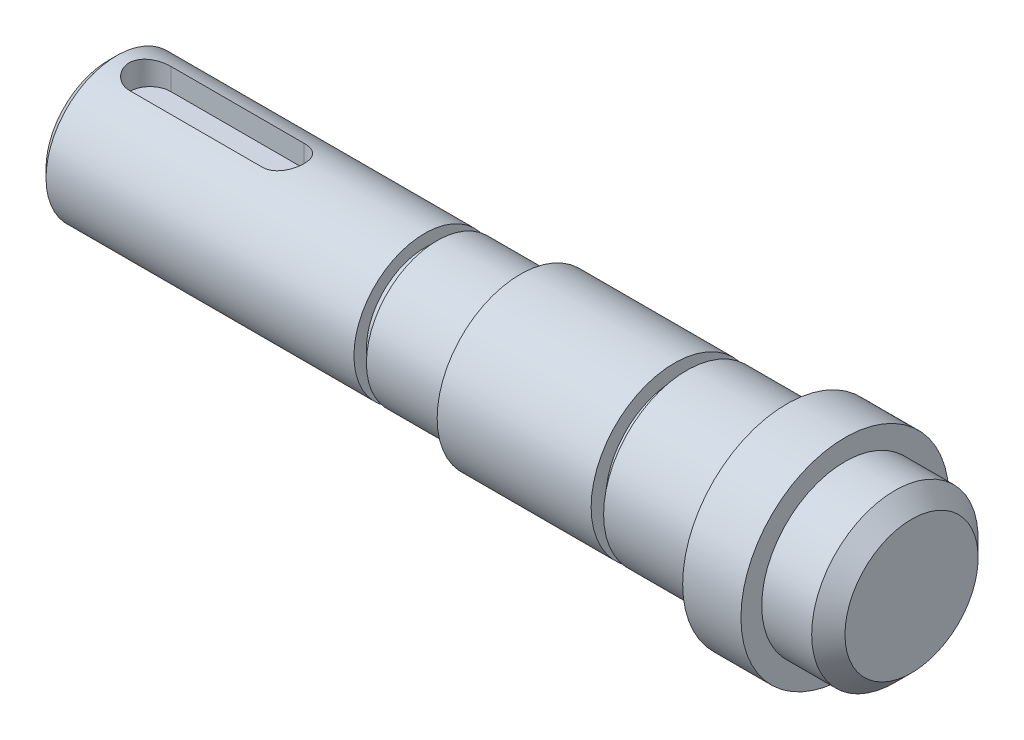
ISO-10303-21;
HEADER;
FILE_DESCRIPTION(('STEP AP214'),'2;1');
FILE_NAME('part.step','',(''),(''),'','','');
FILE_SCHEMA(('AUTOMOTIVE_DESIGN { 1 0 10303 214 1 1 1 1 }'));
ENDSEC;
DATA;
#1=APPLICATION_CONTEXT('core data for automotive mechanical design processes');
#2=APPLICATION_PROTOCOL_DEFINITION('international standard','automotive_design',2000,#1);
#3=PRODUCT_CONTEXT('',#1,'mechanical');
#4=PRODUCT('Part','Part','',(#3));
#5=PRODUCT_RELATED_PRODUCT_CATEGORY('part','',(#4));
#6=PRODUCT_DEFINITION_FORMATION('','',#4);
#7=PRODUCT_DEFINITION_CONTEXT('part definition',#1,'design');
#8=PRODUCT_DEFINITION('design','',#6,#7);
#9=PRODUCT_DEFINITION_SHAPE('','',#8);
#10=(LENGTH_UNIT() NAMED_UNIT(*) SI_UNIT(.MILLI.,.METRE.));
#11=(NAMED_UNIT(*) PLANE_ANGLE_UNIT() SI_UNIT($,.RADIAN.));
#12=(NAMED_UNIT(*) SI_UNIT($,.STERADIAN.) SOLID_ANGLE_UNIT());
#13=UNCERTAINTY_MEASURE_WITH_UNIT(LENGTH_MEASURE(1.E-05),#10,'distance_accuracy_value','');
#14=(GEOMETRIC_REPRESENTATION_CONTEXT(3) GLOBAL_UNCERTAINTY_ASSIGNED_CONTEXT((#13)) GLOBAL_UNIT_ASSIGNED_CONTEXT((#10,
#11,#12)) REPRESENTATION_CONTEXT('',''));
#15=CARTESIAN_POINT('',(0.,0.,0.));
#16=DIRECTION('',(0.,0.,1.));
#17=DIRECTION('',(1.,0.,0.));
#18=AXIS2_PLACEMENT_3D('',#15,#16,#17);
#19=CARTESIAN_POINT('',(96.5,7.99999999999993,0.));
#20=DIRECTION('',(-1.,0.,0.));
#21=DIRECTION('',(0.,0.,1.));
#22=AXIS2_PLACEMENT_3D('',#19,#20,#21);
#23=PLANE('',#22);
#24=CARTESIAN_POINT('',(96.5,0.,0.));
#25=DIRECTION('',(-1.,0.,0.));
#26=DIRECTION('',(0.,0.,1.));
#27=AXIS2_PLACEMENT_3D('',#24,#25,#26);
#28=CIRCLE('',#27,7.99999999999998);
#29=CARTESIAN_POINT('',(96.5,0.,7.99999999999994));
#30=VERTEX_POINT('',#29);
#31=EDGE_CURVE('E153',#30,#30,#28,.T.);
#32=ORIENTED_EDGE('',*,*,#31,.F.);
#33=EDGE_LOOP('',(#32));
#34=FACE_BOUND('',#33,.T.);
#35=ADVANCED_FACE('F31',(#34),#23,.F.);
#36=CARTESIAN_POINT('',(96.5,0.,0.));
#37=DIRECTION('',(-1.,0.,0.));
#38=DIRECTION('',(0.,0.,1.));
#39=AXIS2_PLACEMENT_3D('',#36,#37,#38);
#40=CONICAL_SURFACE('',#39,7.99999999999998,0.78539816339745);
#41=CARTESIAN_POINT('',(94.5,0.,0.));
#42=DIRECTION('',(-1.,0.,0.));
#43=DIRECTION('',(0.,0.,1.));
#44=AXIS2_PLACEMENT_3D('',#41,#42,#43);
#45=CIRCLE('',#44,10.);
#46=CARTESIAN_POINT('',(94.5,0.,9.99999999999996));
#47=VERTEX_POINT('',#46);
#48=EDGE_CURVE('E150',#47,#47,#45,.T.);
#49=ORIENTED_EDGE('',*,*,#48,.F.);
#50=EDGE_LOOP('',(#49));
#51=FACE_BOUND('',#50,.T.);
#52=ORIENTED_EDGE('',*,*,#31,.T.);
#53=EDGE_LOOP('',(#52));
#54=FACE_BOUND('',#53,.T.);
#55=ADVANCED_FACE('F194',(#51,#54),#40,.T.);
#56=CARTESIAN_POINT('',(0.,0.,0.));
#57=DIRECTION('',(-1.,0.,0.));
#58=DIRECTION('',(0.,0.,1.));
#59=AXIS2_PLACEMENT_3D('',#56,#57,#58);
#60=CYLINDRICAL_SURFACE('',#59,10.);
#61=CARTESIAN_POINT('',(88.5,0.,0.));
#62=DIRECTION('',(-1.,0.,0.));
#63=DIRECTION('',(0.,0.,1.));
#64=AXIS2_PLACEMENT_3D('',#61,#62,#63);
#65=CIRCLE('',#64,10.);
#66=CARTESIAN_POINT('',(88.5,0.,9.99999999999997));
#67=VERTEX_POINT('',#66);
#68=EDGE_CURVE('E147',#67,#67,#65,.T.);
#69=ORIENTED_EDGE('',*,*,#68,.F.);
#70=EDGE_LOOP('',(#69));
#71=FACE_BOUND('',#70,.T.);
#72=ORIENTED_EDGE('',*,*,#48,.T.);
#73=EDGE_LOOP('',(#72));
#74=FACE_BOUND('',#73,.T.);
#75=ADVANCED_FACE('F199',(#71,#74),#60,.T.);
#76=CARTESIAN_POINT('',(88.5,12.5,0.));
#77=DIRECTION('',(-1.,0.,0.));
#78=DIRECTION('',(0.,0.,1.));
#79=AXIS2_PLACEMENT_3D('',#76,#77,#78);
#80=PLANE('',#79);
#81=CARTESIAN_POINT('',(88.5,0.,0.));
#82=DIRECTION('',(-1.,0.,0.));
#83=DIRECTION('',(0.,0.,1.));
#84=AXIS2_PLACEMENT_3D('',#81,#82,#83);
#85=CIRCLE('',#84,12.5);
#86=CARTESIAN_POINT('',(88.5,0.,12.5));
#87=VERTEX_POINT('',#86);
#88=EDGE_CURVE('E144',#87,#87,#85,.T.);
#89=ORIENTED_EDGE('',*,*,#88,.F.);
#90=EDGE_LOOP('',(#89));
#91=FACE_BOUND('',#90,.T.);
#92=ORIENTED_EDGE('',*,*,#68,.T.);
#93=EDGE_LOOP('',(#92));
#94=FACE_BOUND('',#93,.T.);
#95=ADVANCED_FACE('F206',(#91,#94),#80,.F.);
#96=CARTESIAN_POINT('',(0.,0.,0.));
#97=DIRECTION('',(-1.,0.,0.));
#98=DIRECTION('',(0.,0.,1.));
#99=AXIS2_PLACEMENT_3D('',#96,#97,#98);
#100=CYLINDRICAL_SURFACE('',#99,12.5);
#101=CARTESIAN_POINT('',(81.5,0.,0.));
#102=DIRECTION('',(-1.,0.,0.));
#103=DIRECTION('',(0.,0.,1.));
#104=AXIS2_PLACEMENT_3D('',#101,#102,#103);
#105=CIRCLE('',#104,12.5);
#106=CARTESIAN_POINT('',(81.5,0.,12.5));
#107=VERTEX_POINT('',#106);
#108=EDGE_CURVE('E141',#107,#107,#105,.T.);
#109=ORIENTED_EDGE('',*,*,#108,.F.);
#110=EDGE_LOOP('',(#109));
#111=FACE_BOUND('',#110,.T.);
#112=ORIENTED_EDGE('',*,*,#88,.T.);
#113=EDGE_LOOP('',(#112));
#114=FACE_BOUND('',#113,.T.);
#115=ADVANCED_FACE('F213',(#111,#114),#100,.T.);
#116=CARTESIAN_POINT('',(81.5,9.99999999999997,0.));
#117=DIRECTION('',(1.,0.,0.));
#118=DIRECTION('',(0.,0.,-1.));
#119=AXIS2_PLACEMENT_3D('',#116,#117,#118);
#120=PLANE('',#119);
#121=CARTESIAN_POINT('',(81.5,0.,0.));
#122=DIRECTION('',(-1.,0.,0.));
#123=DIRECTION('',(0.,0.,1.));
#124=AXIS2_PLACEMENT_3D('',#121,#122,#123);
#125=CIRCLE('',#124,10.);
#126=CARTESIAN_POINT('',(81.5,0.,9.99999999999997));
#127=VERTEX_POINT('',#126);
#128=EDGE_CURVE('E138',#127,#127,#125,.T.);
#129=ORIENTED_EDGE('',*,*,#128,.F.);
#130=EDGE_LOOP('',(#129));
#131=FACE_BOUND('',#130,.T.);
#132=ORIENTED_EDGE('',*,*,#108,.T.);
#133=EDGE_LOOP('',(#132));
#134=FACE_BOUND('',#133,.T.);
#135=ADVANCED_FACE('F217',(#131,#134),#120,.F.);
#136=CARTESIAN_POINT('',(0.,0.,0.));
#137=DIRECTION('',(-1.,0.,0.));
#138=DIRECTION('',(0.,0.,1.));
#139=AXIS2_PLACEMENT_3D('',#136,#137,#138);
#140=CYLINDRICAL_SURFACE('',#139,10.);
#141=CARTESIAN_POINT('',(69.5,0.,0.));
#142=DIRECTION('',(-1.,0.,0.));
#143=DIRECTION('',(0.,0.,1.));
#144=AXIS2_PLACEMENT_3D('',#141,#142,#143);
#145=CIRCLE('',#144,10.);
#146=CARTESIAN_POINT('',(69.5,0.,9.99999999999998));
#147=VERTEX_POINT('',#146);
#148=EDGE_CURVE('E135',#147,#147,#145,.T.);
#149=ORIENTED_EDGE('',*,*,#148,.F.);
#150=EDGE_LOOP('',(#149));
#151=FACE_BOUND('',#150,.T.);
#152=ORIENTED_EDGE('',*,*,#128,.T.);
#153=EDGE_LOOP('',(#152));
#154=FACE_BOUND('',#153,.T.);
#155=ADVANCED_FACE('F221',(#151,#154),#140,.T.);
#156=CARTESIAN_POINT('',(69.5,8.24999999999997,0.));
#157=DIRECTION('',(1.,0.,0.));
#158=DIRECTION('',(0.,0.,-1.));
#159=AXIS2_PLACEMENT_3D('',#156,#157,#158);
#160=PLANE('',#159);
#161=CARTESIAN_POINT('',(69.5,0.,0.));
#162=DIRECTION('',(-1.,0.,0.));
#163=DIRECTION('',(0.,0.,1.));
#164=AXIS2_PLACEMENT_3D('',#161,#162,#163);
#165=CIRCLE('',#164,8.25);
#166=CARTESIAN_POINT('',(69.5,0.,8.24999999999997));
#167=VERTEX_POINT('',#166);
#168=EDGE_CURVE('E132',#167,#167,#165,.T.);
#169=ORIENTED_EDGE('',*,*,#168,.F.);
#170=EDGE_LOOP('',(#169));
#171=FACE_BOUND('',#170,.T.);
#172=ORIENTED_EDGE('',*,*,#148,.T.);
#173=EDGE_LOOP('',(#172));
#174=FACE_BOUND('',#173,.T.);
#175=ADVANCED_FACE('F225',(#171,#174),#160,.F.);
#176=CARTESIAN_POINT('',(0.,0.,0.));
#177=DIRECTION('',(-1.,0.,0.));
#178=DIRECTION('',(0.,0.,1.));
#179=AXIS2_PLACEMENT_3D('',#176,#177,#178);
#180=CYLINDRICAL_SURFACE('',#179,8.25);
#181=CARTESIAN_POINT('',(68.,0.,0.));
#182=DIRECTION('',(-1.,0.,0.));
#183=DIRECTION('',(0.,0.,1.));
#184=AXIS2_PLACEMENT_3D('',#181,#182,#183);
#185=CIRCLE('',#184,8.25);
#186=CARTESIAN_POINT('',(68.,0.,8.24999999999997));
#187=VERTEX_POINT('',#186);
#188=EDGE_CURVE('E129',#187,#187,#185,.T.);
#189=ORIENTED_EDGE('',*,*,#188,.F.);
#190=EDGE_LOOP('',(#189));
#191=FACE_BOUND('',#190,.T.);
#192=ORIENTED_EDGE('',*,*,#168,.T.);
#193=EDGE_LOOP('',(#192));
#194=FACE_BOUND('',#193,.T.);
#195=ADVANCED_FACE('F229',(#191,#194),#180,.T.);
#196=CARTESIAN_POINT('',(68.,9.99999999999998,0.));
#197=DIRECTION('',(-1.,0.,0.));
#198=DIRECTION('',(0.,0.,1.));
#199=AXIS2_PLACEMENT_3D('',#196,#197,#198);
#200=PLANE('',#199);
#201=CARTESIAN_POINT('',(68.,0.,0.));
#202=DIRECTION('',(-1.,0.,0.));
#203=DIRECTION('',(0.,0.,1.));
#204=AXIS2_PLACEMENT_3D('',#201,#202,#203);
#205=CIRCLE('',#204,10.);
#206=CARTESIAN_POINT('',(68.,0.,9.99999999999997));
#207=VERTEX_POINT('',#206);
#208=EDGE_CURVE('E126',#207,#207,#205,.T.);
#209=ORIENTED_EDGE('',*,*,#208,.F.);
#210=EDGE_LOOP('',(#209));
#211=FACE_BOUND('',#210,.T.);
#212=ORIENTED_EDGE('',*,*,#188,.T.);
#213=EDGE_LOOP('',(#212));
#214=FACE_BOUND('',#213,.T.);
#215=ADVANCED_FACE('F233',(#211,#214),#200,.F.);
#216=CARTESIAN_POINT('',(0.,0.,0.));
#217=DIRECTION('',(-1.,0.,0.));
#218=DIRECTION('',(0.,0.,1.));
#219=AXIS2_PLACEMENT_3D('',#216,#217,#218);
#220=CYLINDRICAL_SURFACE('',#219,10.);
#221=CARTESIAN_POINT('',(49.5,0.,0.));
#222=DIRECTION('',(-1.,0.,0.));
#223=DIRECTION('',(0.,0.,1.));
#224=AXIS2_PLACEMENT_3D('',#221,#222,#223);
#225=CIRCLE('',#224,10.);
#226=CARTESIAN_POINT('',(49.5,0.,9.99999999999998));
#227=VERTEX_POINT('',#226);
#228=EDGE_CURVE('E123',#227,#227,#225,.T.);
#229=ORIENTED_EDGE('',*,*,#228,.F.);
#230=EDGE_LOOP('',(#229));
#231=FACE_BOUND('',#230,.T.);
#232=ORIENTED_EDGE('',*,*,#208,.T.);
#233=EDGE_LOOP('',(#232));
#234=FACE_BOUND('',#233,.T.);
#235=ADVANCED_FACE('F237',(#231,#234),#220,.T.);
#236=CARTESIAN_POINT('',(49.5,8.49999999999998,0.));
#237=DIRECTION('',(1.,0.,0.));
#238=DIRECTION('',(0.,0.,-1.));
#239=AXIS2_PLACEMENT_3D('',#236,#237,#238);
#240=PLANE('',#239);
#241=CARTESIAN_POINT('',(49.5,0.,0.));
#242=DIRECTION('',(-1.,0.,0.));
#243=DIRECTION('',(0.,0.,1.));
#244=AXIS2_PLACEMENT_3D('',#241,#242,#243);
#245=CIRCLE('',#244,8.5);
#246=CARTESIAN_POINT('',(49.5,0.,8.49999999999998));
#247=VERTEX_POINT('',#246);
#248=EDGE_CURVE('E120',#247,#247,#245,.T.);
#249=ORIENTED_EDGE('',*,*,#248,.F.);
#250=EDGE_LOOP('',(#249));
#251=FACE_BOUND('',#250,.T.);
#252=ORIENTED_EDGE('',*,*,#228,.T.);
#253=EDGE_LOOP('',(#252));
#254=FACE_BOUND('',#253,.T.);
#255=ADVANCED_FACE('F241',(#251,#254),#240,.F.);
#256=CARTESIAN_POINT('',(0.,0.,0.));
#257=DIRECTION('',(-1.,0.,0.));
#258=DIRECTION('',(0.,0.,1.));
#259=AXIS2_PLACEMENT_3D('',#256,#257,#258);
#260=CYLINDRICAL_SURFACE('',#259,8.49999999999999);
#261=CARTESIAN_POINT('',(39.5,0.,0.));
#262=DIRECTION('',(-1.,0.,0.));
#263=DIRECTION('',(0.,0.,1.));
#264=AXIS2_PLACEMENT_3D('',#261,#262,#263);
#265=CIRCLE('',#264,8.49999999999998);
#266=CARTESIAN_POINT('',(39.5,0.,8.49999999999996));
#267=VERTEX_POINT('',#266);
#268=EDGE_CURVE('E117',#267,#267,#265,.T.);
#269=ORIENTED_EDGE('',*,*,#268,.F.);
#270=EDGE_LOOP('',(#269));
#271=FACE_BOUND('',#270,.T.);
#272=ORIENTED_EDGE('',*,*,#248,.T.);
#273=EDGE_LOOP('',(#272));
#274=FACE_BOUND('',#273,.T.);
#275=ADVANCED_FACE('F245',(#271,#274),#260,.T.);
#276=CARTESIAN_POINT('',(39.5,6.99999999999998,0.));
#277=DIRECTION('',(1.,0.,0.));
#278=DIRECTION('',(0.,0.,-1.));
#279=AXIS2_PLACEMENT_3D('',#276,#277,#278);
#280=PLANE('',#279);
#281=CARTESIAN_POINT('',(39.5,0.,0.));
#282=DIRECTION('',(-1.,0.,0.));
#283=DIRECTION('',(0.,0.,1.));
#284=AXIS2_PLACEMENT_3D('',#281,#282,#283);
#285=CIRCLE('',#284,7.);
#286=CARTESIAN_POINT('',(39.5,0.,6.99999999999998));
#287=VERTEX_POINT('',#286);
#288=EDGE_CURVE('E114',#287,#287,#285,.T.);
#289=ORIENTED_EDGE('',*,*,#288,.F.);
#290=EDGE_LOOP('',(#289));
#291=FACE_BOUND('',#290,.T.);
#292=ORIENTED_EDGE('',*,*,#268,.T.);
#293=EDGE_LOOP('',(#292));
#294=FACE_BOUND('',#293,.T.);
#295=ADVANCED_FACE('F249',(#291,#294),#280,.F.);
#296=CARTESIAN_POINT('',(0.,0.,0.));
#297=DIRECTION('',(-1.,0.,0.));
#298=DIRECTION('',(0.,0.,1.));
#299=AXIS2_PLACEMENT_3D('',#296,#297,#298);
#300=CYLINDRICAL_SURFACE('',#299,7.);
#301=CARTESIAN_POINT('',(38.,0.,0.));
#302=DIRECTION('',(-1.,0.,0.));
#303=DIRECTION('',(0.,0.,1.));
#304=AXIS2_PLACEMENT_3D('',#301,#302,#303);
#305=CIRCLE('',#304,7.);
#306=CARTESIAN_POINT('',(38.,0.,6.99999999999998));
#307=VERTEX_POINT('',#306);
#308=EDGE_CURVE('E111',#307,#307,#305,.T.);
#309=ORIENTED_EDGE('',*,*,#308,.F.);
#310=EDGE_LOOP('',(#309));
#311=FACE_BOUND('',#310,.T.);
#312=ORIENTED_EDGE('',*,*,#288,.T.);
#313=EDGE_LOOP('',(#312));
#314=FACE_BOUND('',#313,.T.);
#315=ADVANCED_FACE('F253',(#311,#314),#300,.T.);
#316=CARTESIAN_POINT('',(38.,8.49999999999999,0.));
#317=DIRECTION('',(-1.,0.,0.));
#318=DIRECTION('',(0.,0.,1.));
#319=AXIS2_PLACEMENT_3D('',#316,#317,#318);
#320=PLANE('',#319);
#321=CARTESIAN_POINT('',(38.,0.,0.));
#322=DIRECTION('',(-1.,0.,0.));
#323=DIRECTION('',(0.,0.,1.));
#324=AXIS2_PLACEMENT_3D('',#321,#322,#323);
#325=CIRCLE('',#324,8.5);
#326=CARTESIAN_POINT('',(38.,0.,8.49999999999999));
#327=VERTEX_POINT('',#326);
#328=EDGE_CURVE('E108',#327,#327,#325,.T.);
#329=ORIENTED_EDGE('',*,*,#328,.F.);
#330=EDGE_LOOP('',(#329));
#331=FACE_BOUND('',#330,.T.);
#332=ORIENTED_EDGE('',*,*,#308,.T.);
#333=EDGE_LOOP('',(#332));
#334=FACE_BOUND('',#333,.T.);
#335=ADVANCED_FACE('F189',(#331,#334),#320,.F.);
#336=CARTESIAN_POINT('',(0.,0.,0.));
#337=DIRECTION('',(-1.,0.,0.));
#338=DIRECTION('',(0.,0.,1.));
#339=AXIS2_PLACEMENT_3D('',#336,#337,#338);
#340=CYLINDRICAL_SURFACE('',#339,8.5);
#341=DIRECTION('',(-1.,0.,0.));
#342=VECTOR('',#341,1.);
#343=CARTESIAN_POINT('',(0.,8.12403840463596,-2.49999999999998));
#344=LINE('',#343,#342);
#345=CARTESIAN_POINT('',(4.99999999999998,8.12403840463596,-2.49999999999998));
#346=VERTEX_POINT('',#345);
#347=CARTESIAN_POINT('',(21.,8.12403840463595,-2.49999999999999));
#348=VERTEX_POINT('',#347);
#349=EDGE_CURVE('E156',#346,#348,#344,.F.);
#350=ORIENTED_EDGE('',*,*,#349,.T.);
#351=CARTESIAN_POINT('',(21.,8.12403840463596,2.5));
#352=CARTESIAN_POINT('',(20.8628738528352,8.12404004769227,2.49999796236333));
#353=CARTESIAN_POINT('',(20.7257274227795,8.12754823490022,2.48867946345813));
#354=CARTESIAN_POINT('',(20.4554351830686,8.14114853701025,2.44381537502387));
#355=CARTESIAN_POINT('',(20.322290848594,8.15124304925465,2.41026169208832));
#356=CARTESIAN_POINT('',(20.0639541637624,8.17677597287571,2.3221578661852));
#357=CARTESIAN_POINT('',(19.9387493485374,8.19220574919404,2.26764163496267));
#358=CARTESIAN_POINT('',(19.6992339670437,8.22665909626875,2.13927079722776));
#359=CARTESIAN_POINT('',(19.5849248956929,8.2456831591037,2.06541354228249));
#360=CARTESIAN_POINT('',(19.3669689082195,8.28583044324546,1.89805242493169));
#361=CARTESIAN_POINT('',(19.263702417056,8.30699705220535,1.80406342823792));
#362=CARTESIAN_POINT('',(19.0741465551868,8.34867315787301,1.60014717785515));
#363=CARTESIAN_POINT('',(18.9878592841427,8.36918257304958,1.49021795590314));
#364=CARTESIAN_POINT('',(18.8330714432255,8.40772468697269,1.25484804530034));
#365=CARTESIAN_POINT('',(18.7649569766824,8.42570029093118,1.12914327438482));
#366=CARTESIAN_POINT('',(18.6509801176098,8.45664648715186,0.86744563703123));
#367=CARTESIAN_POINT('',(18.6051131215159,8.46961811474952,0.731454905756565));
#368=CARTESIAN_POINT('',(18.5381870248728,8.48878785171354,0.457024005838456));
#369=CARTESIAN_POINT('',(18.5164789721526,8.49516280971315,0.318754673888347));
#370=CARTESIAN_POINT('',(18.4964368738836,8.50104289513882,0.0403993943316321));
#371=CARTESIAN_POINT('',(18.4980981032478,8.50054941131059,-0.0996861803221829));
#372=CARTESIAN_POINT('',(18.524307858585,8.49287406928416,-0.373151342435304));
#373=CARTESIAN_POINT('',(18.5481539389706,8.48589749488644,-0.506604918733639));
#374=CARTESIAN_POINT('',(18.6169113819025,8.46628800888345,-0.767524842762454));
#375=CARTESIAN_POINT('',(18.6618240578136,8.45365474462275,-0.894990816659899));
#376=CARTESIAN_POINT('',(18.771926750607,8.42386378069359,-1.14200961129054));
#377=CARTESIAN_POINT('',(18.8373412792392,8.40665632319235,-1.26145611323967));
#378=CARTESIAN_POINT('',(18.9864142561839,8.36954759291859,-1.48790420805442));
#379=CARTESIAN_POINT('',(19.070076897098,8.34964570148466,-1.59490293229939));
#380=CARTESIAN_POINT('',(19.2569306396752,8.30841132230747,-1.79761108283251));
#381=CARTESIAN_POINT('',(19.3607312335547,8.28705315309198,-1.89275419933163));
#382=CARTESIAN_POINT('',(19.5830255645917,8.24596298173466,-2.06443893360173));
#383=CARTESIAN_POINT('',(19.7015206449819,8.22623112853029,-2.14097884894606));
#384=CARTESIAN_POINT('',(19.951282152895,8.190508316972,-2.27384467334688));
#385=CARTESIAN_POINT('',(20.082652874725,8.17455222141957,-2.32998458403205));
#386=CARTESIAN_POINT('',(20.3535605028611,8.14860398612285,-2.41918075403471));
#387=CARTESIAN_POINT('',(20.4930948516538,8.13860998943288,-2.45224420125602));
#388=CARTESIAN_POINT('',(20.7709959921751,8.12612291499099,-2.49330571013838));
#389=CARTESIAN_POINT('',(20.9092246039748,8.12337323394746,-2.50216167789633));
#390=CARTESIAN_POINT('',(21.1851947783698,8.12497791371987,-2.49694674077671));
#391=CARTESIAN_POINT('',(21.3229364035427,8.12933132587802,-2.48287889750256));
#392=CARTESIAN_POINT('',(21.5904957447325,8.14440053150526,-2.43297838264222));
#393=CARTESIAN_POINT('',(21.7204251187245,8.15495668098141,-2.39769132906182));
#394=CARTESIAN_POINT('',(21.9725126022562,8.18107827684706,-2.306983141611));
#395=CARTESIAN_POINT('',(22.0946695408426,8.19664447589366,-2.25155898239258));
#396=CARTESIAN_POINT('',(22.3312522263192,8.23153516861892,-2.12050182351161));
#397=CARTESIAN_POINT('',(22.445394737546,8.25094678118231,-2.04438129566144));
#398=CARTESIAN_POINT('',(22.659599956246,8.29115078956271,-1.87467572806313));
#399=CARTESIAN_POINT('',(22.7596594169673,8.31194350216197,-1.78108667259488));
#400=CARTESIAN_POINT('',(22.9465751570788,8.35347468056186,-1.57507916378058));
#401=CARTESIAN_POINT('',(23.0328249620626,8.37418413333272,-1.46210326579577));
#402=CARTESIAN_POINT('',(23.185152819897,8.41245747759089,-1.22279215701973));
#403=CARTESIAN_POINT('',(23.2512319005436,8.43002152933274,-1.09645762735719));
#404=CARTESIAN_POINT('',(23.360706524561,8.45991559483806,-0.834869700797998));
#405=CARTESIAN_POINT('',(23.4042728727262,8.47228488292634,-0.699692499333704));
#406=CARTESIAN_POINT('',(23.4679360530355,8.4905692350244,-0.423508369003437));
#407=CARTESIAN_POINT('',(23.4880393158086,8.49648606745733,-0.282503048450314));
#408=CARTESIAN_POINT('',(23.5037321499065,8.50109557993595,-0.00428063265451803));
#409=CARTESIAN_POINT('',(23.5002029449852,8.50004796586329,0.13288308799777));
#410=CARTESIAN_POINT('',(23.4708264815311,8.49145383826405,0.404579879027514));
#411=CARTESIAN_POINT('',(23.4449804049082,8.48390766890344,0.539113088331982));
#412=CARTESIAN_POINT('',(23.3722413934308,8.46323443524756,0.800430062071607));
#413=CARTESIAN_POINT('',(23.325560861568,8.45016376169146,0.927277714972636));
#414=CARTESIAN_POINT('',(23.2126674540987,8.41979522614634,1.17140848295972));
#415=CARTESIAN_POINT('',(23.1464514420796,8.40249668545172,1.28869005835389));
#416=CARTESIAN_POINT('',(22.9939784527005,8.36482735062436,1.5143186218301));
#417=CARTESIAN_POINT('',(22.907162667301,8.34437779354526,1.6222747375242));
#418=CARTESIAN_POINT('',(22.7169705342311,8.30297459267522,1.82238178255151));
#419=CARTESIAN_POINT('',(22.6135894992272,8.28202080763743,1.91452822302223));
#420=CARTESIAN_POINT('',(22.3896867072173,8.24128575203088,2.08301441277004));
#421=CARTESIAN_POINT('',(22.268762509931,8.22155447762224,2.15883274542791));
#422=CARTESIAN_POINT('',(22.0153221273272,8.18628031678094,2.28897091376097));
#423=CARTESIAN_POINT('',(21.8828119438329,8.17073527860536,2.34330180082887));
#424=CARTESIAN_POINT('',(21.6261069438649,8.14724808486323,2.4236098697108));
#425=CARTESIAN_POINT('',(21.5027807577974,8.1386244221233,2.45217950771626));
#426=CARTESIAN_POINT('',(21.2529750829652,8.12701933690398,2.49037379107053));
#427=CARTESIAN_POINT('',(21.1264961715477,8.12403688894886,2.50000187967973));
#428=CARTESIAN_POINT('',(21.,8.12403840463596,2.5));
#429=B_SPLINE_CURVE_WITH_KNOTS('',3,(#351,#352,#353,#354,#355,#356,#357,#358,#359,#360,#361,
#362,#363,#364,#365,#366,#367,#368,#369,#370,#371,#372,#373,#374,#375,#376,#377,#378,#379,#380,
#381,#382,#383,#384,#385,#386,#387,#388,#389,#390,#391,#392,#393,#394,#395,#396,#397,#398,#399,
#400,#401,#402,#403,#404,#405,#406,#407,#408,#409,#410,#411,#412,#413,#414,#415,#416,#417,#418,
#419,#420,#421,#422,#423,#424,#425,#426,#427,#428),.UNSPECIFIED.,.T.,.F.,(4,2,2,2,2,2,2,2,2,2,2,
2,2,2,2,2,2,2,2,2,2,2,2,2,2,2,2,2,2,2,2,2,2,2,2,2,2,2,4),(0.,0.410912099878095,
0.821973850269874,1.23237339254285,1.64282916164918,2.06459109250963,2.4864051459976,
2.91657307890348,3.34665196116875,3.76487622839164,4.18301593513788,4.58835076674872,
4.99371087169737,5.40367496479817,5.81373334874932,6.23900922160108,6.66432399789824,
7.09342468655063,7.52239165832583,7.93594602558846,8.34944516487444,8.75274111013303,
9.15609767062927,9.56993137756287,9.98386033532173,10.4127208011549,10.8415594108246,
11.2670947877504,11.6925135089525,12.1021596149396,12.5117840272457,12.9173245470081,
13.3229302115836,13.7411394840136,14.1594673033652,14.5896395325794,15.0195902276005,
15.3987174767158,15.7777758003975),.UNSPECIFIED.);
#430=CARTESIAN_POINT('',(21.,8.12403840463596,2.50000000000001));
#431=VERTEX_POINT('',#430);
#432=EDGE_CURVE('E11',#348,#431,#429,.T.);
#433=ORIENTED_EDGE('',*,*,#432,.T.);
#434=DIRECTION('',(-1.,0.,0.));
#435=VECTOR('',#434,1.);
#436=CARTESIAN_POINT('',(0.,8.12403840463598,2.50000000000002));
#437=LINE('',#436,#435);
#438=CARTESIAN_POINT('',(5.,8.12403840463597,2.50000000000001));
#439=VERTEX_POINT('',#438);
#440=EDGE_CURVE('E42',#431,#439,#437,.T.);
#441=ORIENTED_EDGE('',*,*,#440,.T.);
#442=CARTESIAN_POINT('',(5.,8.12403840463597,2.50000000000001));
#443=CARTESIAN_POINT('',(4.93132012598351,8.12402906918787,2.50000849482377));
#444=CARTESIAN_POINT('',(4.86264564496574,8.12490911076692,2.49717000278528));
#445=CARTESIAN_POINT('',(4.72581945584985,8.12837858671623,2.48586511968108));
#446=CARTESIAN_POINT('',(4.65766763730745,8.13096764928693,2.47739995270245));
#447=CARTESIAN_POINT('',(4.52253481475384,8.13777747849976,2.45493539721692));
#448=CARTESIAN_POINT('',(4.45555134368311,8.14199421689238,2.4409496693403));
#449=CARTESIAN_POINT('',(4.32307387750925,8.15192355487623,2.4075803810989));
#450=CARTESIAN_POINT('',(4.25757991899812,8.15763619117328,2.38819668828002));
#451=CARTESIAN_POINT('',(4.06405334228369,8.17677139859336,2.32218333516285));
#452=CARTESIAN_POINT('',(3.93880885562689,8.19220032894025,2.26766331260793));
#453=CARTESIAN_POINT('',(3.69924749977114,8.22665400749431,2.139288270387));
#454=CARTESIAN_POINT('',(3.58493547462656,8.2456803386569,2.06542473351159));
#455=CARTESIAN_POINT('',(3.36697724635864,8.28582980304438,1.89805567552887));
#456=CARTESIAN_POINT('',(3.26370854424265,8.30699606932741,1.80406793699748));
#457=CARTESIAN_POINT('',(3.07414876913239,8.34867230677749,1.60015164255656));
#458=CARTESIAN_POINT('',(2.98786054184782,8.36918216745794,1.4902204200766));
#459=CARTESIAN_POINT('',(2.83307018553695,8.40772509439063,1.25484557022575));
#460=CARTESIAN_POINT('',(2.76495414137895,8.4257010652051,1.12913784642326));
#461=CARTESIAN_POINT('',(2.65097800842444,8.45664705558545,0.867439712870059));
#462=CARTESIAN_POINT('',(2.60511235500126,8.46961832661639,0.731451883926519));
#463=CARTESIAN_POINT('',(2.53818740241911,8.48878775104767,0.457025436042525));
#464=CARTESIAN_POINT('',(2.51647943407665,8.49516267663223,0.318757581047505));
#465=CARTESIAN_POINT('',(2.49643683305776,8.50104290465191,0.0404023337326233));
#466=CARTESIAN_POINT('',(2.49809796422748,8.50054945212904,-0.0996847242177816));
#467=CARTESIAN_POINT('',(2.52430792738427,8.49287404903278,-0.373152065700681));
#468=CARTESIAN_POINT('',(2.54815418755256,8.48589741931878,-0.506606351501268));
#469=CARTESIAN_POINT('',(2.61691187162766,8.46628787386658,-0.767526211609384));
#470=CARTESIAN_POINT('',(2.66182438351278,8.45365466599278,-0.89499147623647));
#471=CARTESIAN_POINT('',(2.77192711691388,8.42386367197652,-1.14201050505988));
#472=CARTESIAN_POINT('',(2.83734209912868,8.40665607251673,-1.26145783196647));
#473=CARTESIAN_POINT('',(2.98641559493241,8.36954730631605,-1.48790576816495));
#474=CARTESIAN_POINT('',(3.0700780381101,8.34964555974158,-1.59490368885597));
#475=CARTESIAN_POINT('',(3.25692081316675,8.30841337666871,-1.79760092163621));
#476=CARTESIAN_POINT('',(3.36070899040577,8.28705732485783,-1.89273539157047));
#477=CARTESIAN_POINT('',(3.58300405690462,8.24596689824959,-2.06442395091055));
#478=CARTESIAN_POINT('',(3.70151517138102,8.22623299169098,-2.14097268784053));
#479=CARTESIAN_POINT('',(3.95135178976551,8.19049726651394,-2.27388499803611));
#480=CARTESIAN_POINT('',(4.08278745833428,8.17453234339792,-2.33005169701784));
#481=CARTESIAN_POINT('',(4.3537572683008,8.14859211524143,-2.41922275200856));
#482=CARTESIAN_POINT('',(4.49327871917305,8.13860768891974,-2.4522623937834));
#483=CARTESIAN_POINT('',(4.69507757930821,8.12953164409691,-2.48209216527631));
#484=CARTESIAN_POINT('',(4.75589533912242,8.12747604590249,-2.48880708529661));
#485=CARTESIAN_POINT('',(4.87779853307321,8.12472934803225,-2.49775684694219));
#486=CARTESIAN_POINT('',(4.93888342988086,8.1240362093203,-2.49999838344213));
#487=CARTESIAN_POINT('',(4.99999999999998,8.12403840463596,-2.49999999999998));
#488=B_SPLINE_CURVE_WITH_KNOTS('',3,(#442,#443,#444,#445,#446,#447,#448,#449,#450,#451,#452,
#453,#454,#455,#456,#457,#458,#459,#460,#461,#462,#463,#464,#465,#466,#467,#468,#469,#470,#471,
#472,#473,#474,#475,#476,#477,#478,#479,#480,#481,#482,#483,#484,#485,#486,#487),.UNSPECIFIED.,
.F.,.F.,(4,2,2,2,2,2,2,2,2,2,2,2,2,2,2,2,2,2,2,2,2,2,4),(0.,0.205966154303659,0.411887515184555,
0.617302486138782,0.822722497965402,1.23305966556148,1.64357781480005,2.06533049675579,
2.48715379896952,2.91733102657664,3.3474006151165,3.76562050724646,4.18376458896797,
4.58910158908383,4.9944595253604,5.40442657694558,5.81448200221468,6.23971616695719,
6.66507264934228,7.09443475825321,7.52314033790764,7.70665727258005,7.88989934885714),.UNSPECIFIED.);
#489=EDGE_CURVE('E158',#439,#346,#488,.T.);
#490=ORIENTED_EDGE('',*,*,#489,.T.);
#491=EDGE_LOOP('',(#350,#433,#441,#490));
#492=FACE_BOUND('',#491,.T.);
#493=CARTESIAN_POINT('',(1.,0.,0.));
#494=DIRECTION('',(-1.,0.,0.));
#495=DIRECTION('',(0.,0.,1.));
#496=AXIS2_PLACEMENT_3D('',#493,#494,#495);
#497=CIRCLE('',#496,8.5);
#498=CARTESIAN_POINT('',(0.999999999999997,0.,8.5));
#499=VERTEX_POINT('',#498);
#500=EDGE_CURVE('E105',#499,#499,#497,.T.);
#501=ORIENTED_EDGE('',*,*,#500,.F.);
#502=EDGE_LOOP('',(#501));
#503=FACE_BOUND('',#502,.T.);
#504=ORIENTED_EDGE('',*,*,#328,.T.);
#505=EDGE_LOOP('',(#504));
#506=FACE_BOUND('',#505,.T.);
#507=ADVANCED_FACE('F164',(#492,#503,#506),#340,.T.);
#508=CARTESIAN_POINT('',(1.,0.,0.));
#509=DIRECTION('',(1.,0.,0.));
#510=DIRECTION('',(0.,0.,-1.));
#511=AXIS2_PLACEMENT_3D('',#508,#509,#510);
#512=CONICAL_SURFACE('',#511,8.5,0.78539816339745);
#513=CARTESIAN_POINT('',(0.,0.,0.));
#514=DIRECTION('',(-1.,0.,0.));
#515=DIRECTION('',(0.,0.,1.));
#516=AXIS2_PLACEMENT_3D('',#513,#514,#515);
#517=CIRCLE('',#516,7.5);
#518=CARTESIAN_POINT('',(0.,0.,7.5));
#519=VERTEX_POINT('',#518);
#520=EDGE_CURVE('E99',#519,#519,#517,.T.);
#521=ORIENTED_EDGE('',*,*,#520,.F.);
#522=EDGE_LOOP('',(#521));
#523=FACE_BOUND('',#522,.T.);
#524=ORIENTED_EDGE('',*,*,#500,.T.);
#525=EDGE_LOOP('',(#524));
#526=FACE_BOUND('',#525,.T.);
#527=ADVANCED_FACE('F182',(#523,#526),#512,.T.);
#528=CARTESIAN_POINT('',(0.,0.,0.));
#529=DIRECTION('',(1.,0.,0.));
#530=DIRECTION('',(0.,0.,-1.));
#531=AXIS2_PLACEMENT_3D('',#528,#529,#530);
#532=PLANE('',#531);
#533=ORIENTED_EDGE('',*,*,#520,.T.);
#534=EDGE_LOOP('',(#533));
#535=FACE_BOUND('',#534,.T.);
#536=ADVANCED_FACE('F180',(#535),#532,.F.);
#537=CARTESIAN_POINT('',(21.,5.49999999999999,0.));
#538=DIRECTION('',(0.,1.,0.));
#539=DIRECTION('',(0.,0.,1.));
#540=AXIS2_PLACEMENT_3D('',#537,#538,#539);
#541=CYLINDRICAL_SURFACE('',#540,2.5);
#542=DIRECTION('',(0.,1.,0.));
#543=VECTOR('',#542,1.);
#544=CARTESIAN_POINT('',(21.,5.49999999999999,-2.5));
#545=LINE('',#544,#543);
#546=CARTESIAN_POINT('',(21.,5.49999999999999,-2.5));
#547=VERTEX_POINT('',#546);
#548=EDGE_CURVE('E49',#547,#348,#545,.T.);
#549=ORIENTED_EDGE('',*,*,#548,.F.);
#550=CARTESIAN_POINT('',(21.,5.49999999999999,0.));
#551=DIRECTION('',(0.,1.,0.));
#552=DIRECTION('',(0.,0.,1.));
#553=AXIS2_PLACEMENT_3D('',#550,#551,#552);
#554=CIRCLE('',#553,2.5);
#555=CARTESIAN_POINT('',(21.,5.5,2.5));
#556=VERTEX_POINT('',#555);
#557=EDGE_CURVE('E76',#556,#547,#554,.T.);
#558=ORIENTED_EDGE('',*,*,#557,.F.);
#559=DIRECTION('',(0.,1.,0.));
#560=VECTOR('',#559,1.);
#561=CARTESIAN_POINT('',(21.,5.5,2.5));
#562=LINE('',#561,#560);
#563=EDGE_CURVE('E97',#556,#431,#562,.T.);
#564=ORIENTED_EDGE('',*,*,#563,.T.);
#565=ORIENTED_EDGE('',*,*,#432,.F.);
#566=EDGE_LOOP('',(#549,#558,#564,#565));
#567=FACE_BOUND('',#566,.T.);
#568=ADVANCED_FACE('F74',(#567),#541,.F.);
#569=CARTESIAN_POINT('',(21.,5.5,2.5));
#570=DIRECTION('',(0.,0.,1.));
#571=DIRECTION('',(1.,0.,0.));
#572=AXIS2_PLACEMENT_3D('',#569,#570,#571);
#573=PLANE('',#572);
#574=ORIENTED_EDGE('',*,*,#563,.F.);
#575=DIRECTION('',(1.,0.,0.));
#576=VECTOR('',#575,1.);
#577=CARTESIAN_POINT('',(21.,5.5,2.5));
#578=LINE('',#577,#576);
#579=CARTESIAN_POINT('',(5.,5.50000000000001,2.50000000000001));
#580=VERTEX_POINT('',#579);
#581=EDGE_CURVE('E80',#580,#556,#578,.T.);
#582=ORIENTED_EDGE('',*,*,#581,.F.);
#583=DIRECTION('',(0.,1.,0.));
#584=VECTOR('',#583,1.);
#585=CARTESIAN_POINT('',(5.,5.50000000000001,2.50000000000001));
#586=LINE('',#585,#584);
#587=EDGE_CURVE('E100',#580,#439,#586,.T.);
#588=ORIENTED_EDGE('',*,*,#587,.T.);
#589=ORIENTED_EDGE('',*,*,#440,.F.);
#590=EDGE_LOOP('',(#574,#582,#588,#589));
#591=FACE_BOUND('',#590,.T.);
#592=ADVANCED_FACE('F173',(#591),#573,.F.);
#593=CARTESIAN_POINT('',(4.99999999999999,5.5,0.));
#594=DIRECTION('',(0.,1.,0.));
#595=DIRECTION('',(0.,0.,1.));
#596=AXIS2_PLACEMENT_3D('',#593,#594,#595);
#597=CYLINDRICAL_SURFACE('',#596,2.5);
#598=ORIENTED_EDGE('',*,*,#587,.F.);
#599=CARTESIAN_POINT('',(4.99999999999999,5.5,0.));
#600=DIRECTION('',(0.,1.,0.));
#601=DIRECTION('',(0.,0.,1.));
#602=AXIS2_PLACEMENT_3D('',#599,#600,#601);
#603=CIRCLE('',#602,2.5);
#604=CARTESIAN_POINT('',(5.,5.5,-2.49999999999999));
#605=VERTEX_POINT('',#604);
#606=EDGE_CURVE('E89',#605,#580,#603,.T.);
#607=ORIENTED_EDGE('',*,*,#606,.F.);
#608=DIRECTION('',(0.,1.,0.));
#609=VECTOR('',#608,1.);
#610=CARTESIAN_POINT('',(5.,5.5,-2.49999999999999));
#611=LINE('',#610,#609);
#612=EDGE_CURVE('E79',#605,#346,#611,.T.);
#613=ORIENTED_EDGE('',*,*,#612,.T.);
#614=ORIENTED_EDGE('',*,*,#489,.F.);
#615=EDGE_LOOP('',(#598,#607,#613,#614));
#616=FACE_BOUND('',#615,.T.);
#617=ADVANCED_FACE('F168',(#616),#597,.F.);
#618=CARTESIAN_POINT('',(21.,5.49999999999999,-2.5));
#619=DIRECTION('',(0.,0.,-1.));
#620=DIRECTION('',(-1.,0.,0.));
#621=AXIS2_PLACEMENT_3D('',#618,#619,#620);
#622=PLANE('',#621);
#623=ORIENTED_EDGE('',*,*,#612,.F.);
#624=DIRECTION('',(-1.,0.,0.));
#625=VECTOR('',#624,1.);
#626=CARTESIAN_POINT('',(21.,5.49999999999999,-2.5));
#627=LINE('',#626,#625);
#628=EDGE_CURVE('E83',#547,#605,#627,.T.);
#629=ORIENTED_EDGE('',*,*,#628,.F.);
#630=ORIENTED_EDGE('',*,*,#548,.T.);
#631=ORIENTED_EDGE('',*,*,#349,.F.);
#632=EDGE_LOOP('',(#623,#629,#630,#631));
#633=FACE_BOUND('',#632,.T.);
#634=ADVANCED_FACE('F84',(#633),#622,.F.);
#635=CARTESIAN_POINT('',(21.,5.49999999999999,0.));
#636=DIRECTION('',(0.,1.,0.));
#637=DIRECTION('',(0.,0.,1.));
#638=AXIS2_PLACEMENT_3D('',#635,#636,#637);
#639=PLANE('',#638);
#640=ORIENTED_EDGE('',*,*,#557,.T.);
#641=ORIENTED_EDGE('',*,*,#628,.T.);
#642=ORIENTED_EDGE('',*,*,#606,.T.);
#643=ORIENTED_EDGE('',*,*,#581,.T.);
#644=EDGE_LOOP('',(#640,#641,#642,#643));
#645=FACE_BOUND('',#644,.T.);
#646=ADVANCED_FACE('F91',(#645),#639,.T.);
#647=CLOSED_SHELL('',(#35,#55,#75,#95,#115,#135,#155,#175,#195,#215,#235,#255,#275,#295,#315,
#335,#507,#527,#536,#568,#592,#617,#634,#646));
#648=MANIFOLD_SOLID_BREP('B2',#647);
#649=ADVANCED_BREP_SHAPE_REPRESENTATION('',(#18,#648),#14);
#650=SHAPE_DEFINITION_REPRESENTATION(#9,#649);
ENDSEC;
END-ISO-10303-21;
